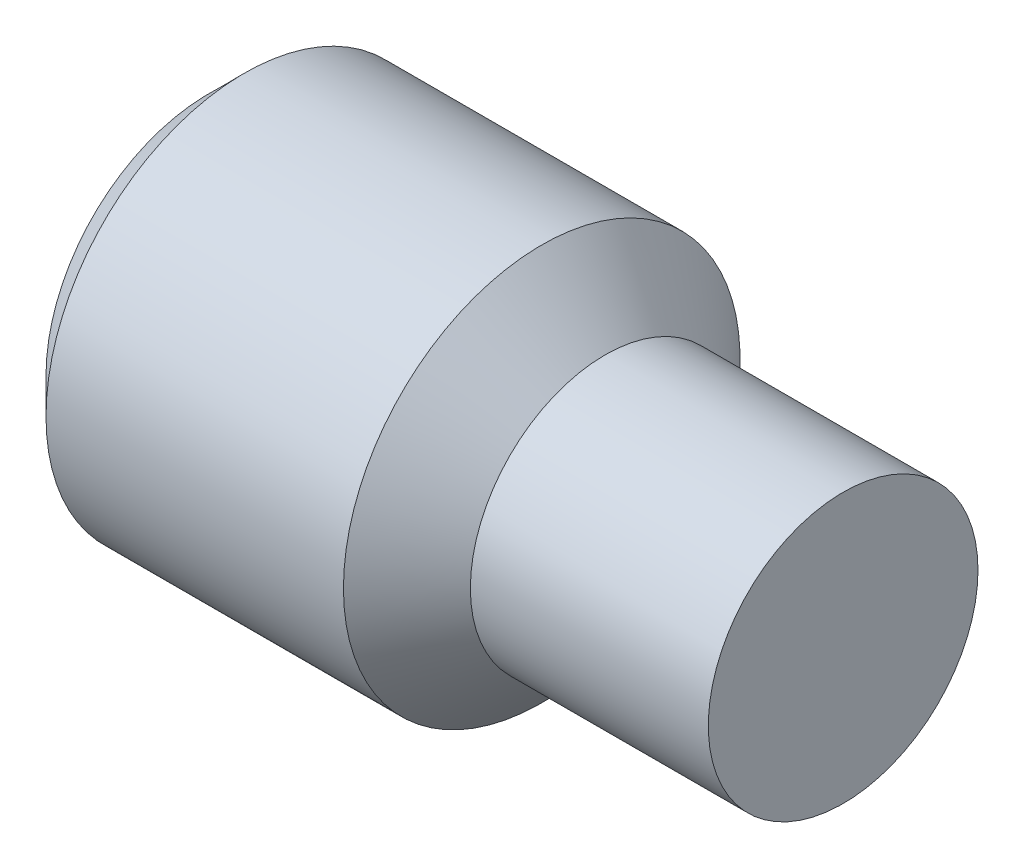
ISO-10303-21;
HEADER;
FILE_DESCRIPTION(('STEP AP214'),'2;1');
FILE_NAME('part.step','',(''),(''),'','','');
FILE_SCHEMA(('AUTOMOTIVE_DESIGN { 1 0 10303 214 1 1 1 1 }'));
ENDSEC;
DATA;
#1=APPLICATION_CONTEXT('core data for automotive mechanical design processes');
#2=APPLICATION_PROTOCOL_DEFINITION('international standard','automotive_design',2000,#1);
#3=PRODUCT_CONTEXT('',#1,'mechanical');
#4=PRODUCT('Part','Part','',(#3));
#5=PRODUCT_RELATED_PRODUCT_CATEGORY('part','',(#4));
#6=PRODUCT_DEFINITION_FORMATION('','',#4);
#7=PRODUCT_DEFINITION_CONTEXT('part definition',#1,'design');
#8=PRODUCT_DEFINITION('design','',#6,#7);
#9=PRODUCT_DEFINITION_SHAPE('','',#8);
#10=(LENGTH_UNIT() NAMED_UNIT(*) SI_UNIT(.MILLI.,.METRE.));
#11=(NAMED_UNIT(*) PLANE_ANGLE_UNIT() SI_UNIT($,.RADIAN.));
#12=(NAMED_UNIT(*) SI_UNIT($,.STERADIAN.) SOLID_ANGLE_UNIT());
#13=UNCERTAINTY_MEASURE_WITH_UNIT(LENGTH_MEASURE(1.E-05),#10,'distance_accuracy_value','');
#14=(GEOMETRIC_REPRESENTATION_CONTEXT(3) GLOBAL_UNCERTAINTY_ASSIGNED_CONTEXT((#13)) GLOBAL_UNIT_ASSIGNED_CONTEXT((#10,
#11,#12)) REPRESENTATION_CONTEXT('',''));
#15=CARTESIAN_POINT('',(0.,0.,0.));
#16=DIRECTION('',(0.,0.,1.));
#17=DIRECTION('',(1.,0.,0.));
#18=AXIS2_PLACEMENT_3D('',#15,#16,#17);
#19=CARTESIAN_POINT('',(16.,0.,0.));
#20=DIRECTION('',(-1.,0.,0.));
#21=DIRECTION('',(0.,0.,1.));
#22=AXIS2_PLACEMENT_3D('',#19,#20,#21);
#23=CYLINDRICAL_SURFACE('',#22,5.);
#24=CARTESIAN_POINT('',(8.40000000000002,0.,0.));
#25=DIRECTION('',(-1.,0.,0.));
#26=DIRECTION('',(0.,0.,1.));
#27=AXIS2_PLACEMENT_3D('',#24,#25,#26);
#28=CIRCLE('',#27,5.);
#29=CARTESIAN_POINT('',(8.40000000000002,0.,5.));
#30=VERTEX_POINT('',#29);
#31=EDGE_CURVE('E142',#30,#30,#28,.T.);
#32=ORIENTED_EDGE('',*,*,#31,.T.);
#33=EDGE_LOOP('',(#32));
#34=FACE_BOUND('',#33,.T.);
#35=CARTESIAN_POINT('',(0.89999999999999,0.,0.));
#36=DIRECTION('',(-1.,0.,0.));
#37=DIRECTION('',(0.,0.,1.));
#38=AXIS2_PLACEMENT_3D('',#35,#36,#37);
#39=CIRCLE('',#38,5.);
#40=CARTESIAN_POINT('',(0.89999999999999,0.,5.));
#41=VERTEX_POINT('',#40);
#42=EDGE_CURVE('E153',#41,#41,#39,.T.);
#43=ORIENTED_EDGE('',*,*,#42,.F.);
#44=EDGE_LOOP('',(#43));
#45=FACE_BOUND('',#44,.T.);
#46=ADVANCED_FACE('F29',(#34,#45),#23,.T.);
#47=CARTESIAN_POINT('',(10.,0.,0.));
#48=DIRECTION('',(-1.,0.,0.));
#49=DIRECTION('',(0.,0.,1.));
#50=AXIS2_PLACEMENT_3D('',#47,#48,#49);
#51=CONICAL_SURFACE('',#50,3.4,0.785398163397454);
#52=ORIENTED_EDGE('',*,*,#31,.F.);
#53=EDGE_LOOP('',(#52));
#54=FACE_BOUND('',#53,.T.);
#55=CARTESIAN_POINT('',(10.,0.,0.));
#56=DIRECTION('',(-1.,0.,0.));
#57=DIRECTION('',(0.,0.,1.));
#58=AXIS2_PLACEMENT_3D('',#55,#56,#57);
#59=CIRCLE('',#58,3.4);
#60=CARTESIAN_POINT('',(10.,0.,3.4));
#61=VERTEX_POINT('',#60);
#62=EDGE_CURVE('E147',#61,#61,#59,.T.);
#63=ORIENTED_EDGE('',*,*,#62,.T.);
#64=EDGE_LOOP('',(#63));
#65=FACE_BOUND('',#64,.T.);
#66=ADVANCED_FACE('F161',(#54,#65),#51,.T.);
#67=CARTESIAN_POINT('',(16.,0.,0.));
#68=DIRECTION('',(1.,0.,0.));
#69=DIRECTION('',(0.,0.,-1.));
#70=AXIS2_PLACEMENT_3D('',#67,#68,#69);
#71=PLANE('',#70);
#72=CARTESIAN_POINT('',(16.,0.,0.));
#73=DIRECTION('',(1.,0.,0.));
#74=DIRECTION('',(0.,0.,-1.));
#75=AXIS2_PLACEMENT_3D('',#72,#73,#74);
#76=CIRCLE('',#75,3.4);
#77=CARTESIAN_POINT('',(16.,0.,-3.4));
#78=VERTEX_POINT('',#77);
#79=EDGE_CURVE('E140',#78,#78,#76,.T.);
#80=ORIENTED_EDGE('',*,*,#79,.T.);
#81=EDGE_LOOP('',(#80));
#82=FACE_BOUND('',#81,.T.);
#83=ADVANCED_FACE('F167',(#82),#71,.T.);
#84=CARTESIAN_POINT('',(10.,0.,0.));
#85=DIRECTION('',(1.,0.,0.));
#86=DIRECTION('',(0.,0.,-1.));
#87=AXIS2_PLACEMENT_3D('',#84,#85,#86);
#88=CYLINDRICAL_SURFACE('',#87,3.4);
#89=ORIENTED_EDGE('',*,*,#62,.F.);
#90=EDGE_LOOP('',(#89));
#91=FACE_BOUND('',#90,.T.);
#92=ORIENTED_EDGE('',*,*,#79,.F.);
#93=EDGE_LOOP('',(#92));
#94=FACE_BOUND('',#93,.T.);
#95=ADVANCED_FACE('F174',(#91,#94),#88,.T.);
#96=CARTESIAN_POINT('',(0.,0.,0.));
#97=DIRECTION('',(1.,0.,0.));
#98=DIRECTION('',(0.,0.,-1.));
#99=AXIS2_PLACEMENT_3D('',#96,#97,#98);
#100=CONICAL_SURFACE('',#99,4.1,0.785398163397454);
#101=ORIENTED_EDGE('',*,*,#42,.T.);
#102=EDGE_LOOP('',(#101));
#103=FACE_BOUND('',#102,.T.);
#104=CARTESIAN_POINT('',(0.,0.,0.));
#105=DIRECTION('',(-1.,0.,0.));
#106=DIRECTION('',(0.,0.,1.));
#107=AXIS2_PLACEMENT_3D('',#104,#105,#106);
#108=CIRCLE('',#107,4.1);
#109=CARTESIAN_POINT('',(0.,0.,4.1));
#110=VERTEX_POINT('',#109);
#111=EDGE_CURVE('E150',#110,#110,#108,.T.);
#112=ORIENTED_EDGE('',*,*,#111,.F.);
#113=EDGE_LOOP('',(#112));
#114=FACE_BOUND('',#113,.T.);
#115=ADVANCED_FACE('F157',(#103,#114),#100,.T.);
#116=CARTESIAN_POINT('',(6.,-11.1414213562373,0.));
#117=DIRECTION('',(-1.,0.,0.));
#118=DIRECTION('',(0.,0.,1.));
#119=AXIS2_PLACEMENT_3D('',#116,#117,#118);
#120=PLANE('',#119);
#121=DIRECTION('',(0.,-0.499999999999998,0.86602540378444));
#122=VECTOR('',#121,1.);
#123=CARTESIAN_POINT('',(6.,-4.95041884852041,3.57437696438398));
#124=LINE('',#123,#122);
#125=CARTESIAN_POINT('',(6.,-1.44337567297408,-2.5));
#126=VERTEX_POINT('',#125);
#127=CARTESIAN_POINT('',(6.,-2.88675134594813,0.));
#128=VERTEX_POINT('',#127);
#129=EDGE_CURVE('E113',#126,#128,#124,.T.);
#130=ORIENTED_EDGE('',*,*,#129,.T.);
#131=DIRECTION('',(0.,0.499999999999998,0.86602540378444));
#132=VECTOR('',#131,1.);
#133=CARTESIAN_POINT('',(6.,-4.95041884852041,-3.57437696438398));
#134=LINE('',#133,#132);
#135=CARTESIAN_POINT('',(6.,-1.44337567297408,2.5));
#136=VERTEX_POINT('',#135);
#137=EDGE_CURVE('E116',#128,#136,#134,.T.);
#138=ORIENTED_EDGE('',*,*,#137,.T.);
#139=DIRECTION('',(0.,1.,0.));
#140=VECTOR('',#139,1.);
#141=CARTESIAN_POINT('',(6.,-11.1414213562373,2.5));
#142=LINE('',#141,#140);
#143=CARTESIAN_POINT('',(6.,1.44337567297408,2.5));
#144=VERTEX_POINT('',#143);
#145=EDGE_CURVE('E89',#136,#144,#142,.T.);
#146=ORIENTED_EDGE('',*,*,#145,.T.);
#147=DIRECTION('',(0.,0.499999999999998,-0.86602540378444));
#148=VECTOR('',#147,1.);
#149=CARTESIAN_POINT('',(6.,-0.620291829598198,6.07437696438398));
#150=LINE('',#149,#148);
#151=CARTESIAN_POINT('',(6.,2.88675134594814,0.));
#152=VERTEX_POINT('',#151);
#153=EDGE_CURVE('E119',#144,#152,#150,.T.);
#154=ORIENTED_EDGE('',*,*,#153,.T.);
#155=DIRECTION('',(0.,-0.499999999999998,-0.86602540378444));
#156=VECTOR('',#155,1.);
#157=CARTESIAN_POINT('',(6.,-0.620291829598187,-6.07437696438397));
#158=LINE('',#157,#156);
#159=CARTESIAN_POINT('',(6.,1.44337567297408,-2.5));
#160=VERTEX_POINT('',#159);
#161=EDGE_CURVE('E122',#152,#160,#158,.T.);
#162=ORIENTED_EDGE('',*,*,#161,.T.);
#163=DIRECTION('',(0.,-1.,0.));
#164=VECTOR('',#163,1.);
#165=CARTESIAN_POINT('',(6.,-11.1414213562373,-2.5));
#166=LINE('',#165,#164);
#167=EDGE_CURVE('E125',#160,#126,#166,.T.);
#168=ORIENTED_EDGE('',*,*,#167,.T.);
#169=EDGE_LOOP('',(#130,#138,#146,#154,#162,#168));
#170=FACE_BOUND('',#169,.T.);
#171=ADVANCED_FACE('F136',(#170),#120,.T.);
#172=CARTESIAN_POINT('',(6.,-11.1414213562373,2.5));
#173=DIRECTION('',(0.,0.,1.));
#174=DIRECTION('',(1.,0.,0.));
#175=AXIS2_PLACEMENT_3D('',#172,#173,#174);
#176=PLANE('',#175);
#177=DIRECTION('',(0.,1.,0.));
#178=VECTOR('',#177,1.);
#179=CARTESIAN_POINT('',(0.,-11.1414213562373,2.5));
#180=LINE('',#179,#178);
#181=CARTESIAN_POINT('',(0.,-1.44337567297408,2.5));
#182=VERTEX_POINT('',#181);
#183=CARTESIAN_POINT('',(0.,1.44337567297408,2.5));
#184=VERTEX_POINT('',#183);
#185=EDGE_CURVE('E86',#182,#184,#180,.T.);
#186=ORIENTED_EDGE('',*,*,#185,.T.);
#187=DIRECTION('',(-1.,0.,0.));
#188=VECTOR('',#187,1.);
#189=CARTESIAN_POINT('',(6.,1.44337567297408,2.5));
#190=LINE('',#189,#188);
#191=EDGE_CURVE('E93',#144,#184,#190,.T.);
#192=ORIENTED_EDGE('',*,*,#191,.F.);
#193=ORIENTED_EDGE('',*,*,#145,.F.);
#194=DIRECTION('',(-1.,0.,0.));
#195=VECTOR('',#194,1.);
#196=CARTESIAN_POINT('',(6.,-1.44337567297408,2.5));
#197=LINE('',#196,#195);
#198=EDGE_CURVE('E82',#136,#182,#197,.T.);
#199=ORIENTED_EDGE('',*,*,#198,.T.);
#200=EDGE_LOOP('',(#186,#192,#193,#199));
#201=FACE_BOUND('',#200,.T.);
#202=ADVANCED_FACE('F84',(#201),#176,.F.);
#203=CARTESIAN_POINT('',(6.,-0.620291829598198,6.07437696438398));
#204=DIRECTION('',(0.,0.86602540378444,0.499999999999998));
#205=DIRECTION('',(0.,-0.499999999999998,0.86602540378444));
#206=AXIS2_PLACEMENT_3D('',#203,#204,#205);
#207=PLANE('',#206);
#208=DIRECTION('',(0.,0.499999999999998,-0.86602540378444));
#209=VECTOR('',#208,1.);
#210=CARTESIAN_POINT('',(0.,-0.620291829598198,6.07437696438398));
#211=LINE('',#210,#209);
#212=CARTESIAN_POINT('',(0.,2.88675134594814,0.));
#213=VERTEX_POINT('',#212);
#214=EDGE_CURVE('E103',#184,#213,#211,.T.);
#215=ORIENTED_EDGE('',*,*,#214,.T.);
#216=DIRECTION('',(-1.,0.,0.));
#217=VECTOR('',#216,1.);
#218=CARTESIAN_POINT('',(6.,2.88675134594814,0.));
#219=LINE('',#218,#217);
#220=EDGE_CURVE('E129',#152,#213,#219,.T.);
#221=ORIENTED_EDGE('',*,*,#220,.F.);
#222=ORIENTED_EDGE('',*,*,#153,.F.);
#223=ORIENTED_EDGE('',*,*,#191,.T.);
#224=EDGE_LOOP('',(#215,#221,#222,#223));
#225=FACE_BOUND('',#224,.T.);
#226=ADVANCED_FACE('F133',(#225),#207,.F.);
#227=CARTESIAN_POINT('',(6.,-0.620291829598187,-6.07437696438397));
#228=DIRECTION('',(0.,0.86602540378444,-0.499999999999997));
#229=DIRECTION('',(0.,0.499999999999998,0.86602540378444));
#230=AXIS2_PLACEMENT_3D('',#227,#228,#229);
#231=PLANE('',#230);
#232=DIRECTION('',(0.,-0.499999999999998,-0.86602540378444));
#233=VECTOR('',#232,1.);
#234=CARTESIAN_POINT('',(0.,-0.620291829598187,-6.07437696438397));
#235=LINE('',#234,#233);
#236=CARTESIAN_POINT('',(0.,1.44337567297408,-2.5));
#237=VERTEX_POINT('',#236);
#238=EDGE_CURVE('E105',#213,#237,#235,.T.);
#239=ORIENTED_EDGE('',*,*,#238,.T.);
#240=DIRECTION('',(-1.,0.,0.));
#241=VECTOR('',#240,1.);
#242=CARTESIAN_POINT('',(6.,1.44337567297408,-2.5));
#243=LINE('',#242,#241);
#244=EDGE_CURVE('E37',#160,#237,#243,.T.);
#245=ORIENTED_EDGE('',*,*,#244,.F.);
#246=ORIENTED_EDGE('',*,*,#161,.F.);
#247=ORIENTED_EDGE('',*,*,#220,.T.);
#248=EDGE_LOOP('',(#239,#245,#246,#247));
#249=FACE_BOUND('',#248,.T.);
#250=ADVANCED_FACE('F194',(#249),#231,.F.);
#251=CARTESIAN_POINT('',(6.,-11.1414213562373,-2.5));
#252=DIRECTION('',(0.,0.,-1.));
#253=DIRECTION('',(-1.,0.,0.));
#254=AXIS2_PLACEMENT_3D('',#251,#252,#253);
#255=PLANE('',#254);
#256=DIRECTION('',(0.,-1.,0.));
#257=VECTOR('',#256,1.);
#258=CARTESIAN_POINT('',(0.,-11.1414213562373,-2.5));
#259=LINE('',#258,#257);
#260=CARTESIAN_POINT('',(0.,-1.44337567297408,-2.5));
#261=VERTEX_POINT('',#260);
#262=EDGE_CURVE('E111',#237,#261,#259,.T.);
#263=ORIENTED_EDGE('',*,*,#262,.T.);
#264=DIRECTION('',(-1.,0.,0.));
#265=VECTOR('',#264,1.);
#266=CARTESIAN_POINT('',(6.,-1.44337567297408,-2.5));
#267=LINE('',#266,#265);
#268=EDGE_CURVE('E11',#126,#261,#267,.T.);
#269=ORIENTED_EDGE('',*,*,#268,.F.);
#270=ORIENTED_EDGE('',*,*,#167,.F.);
#271=ORIENTED_EDGE('',*,*,#244,.T.);
#272=EDGE_LOOP('',(#263,#269,#270,#271));
#273=FACE_BOUND('',#272,.T.);
#274=ADVANCED_FACE('F139',(#273),#255,.F.);
#275=CARTESIAN_POINT('',(6.,-4.95041884852041,3.57437696438398));
#276=DIRECTION('',(0.,-0.86602540378444,-0.499999999999997));
#277=DIRECTION('',(0.,0.499999999999998,-0.86602540378444));
#278=AXIS2_PLACEMENT_3D('',#275,#276,#277);
#279=PLANE('',#278);
#280=DIRECTION('',(0.,-0.499999999999998,0.86602540378444));
#281=VECTOR('',#280,1.);
#282=CARTESIAN_POINT('',(0.,-4.95041884852041,3.57437696438398));
#283=LINE('',#282,#281);
#284=CARTESIAN_POINT('',(0.,-2.88675134594814,0.));
#285=VERTEX_POINT('',#284);
#286=EDGE_CURVE('E44',#261,#285,#283,.T.);
#287=ORIENTED_EDGE('',*,*,#286,.T.);
#288=DIRECTION('',(-1.,0.,0.));
#289=VECTOR('',#288,1.);
#290=CARTESIAN_POINT('',(6.,-2.88675134594813,0.));
#291=LINE('',#290,#289);
#292=EDGE_CURVE('E32',#128,#285,#291,.T.);
#293=ORIENTED_EDGE('',*,*,#292,.F.);
#294=ORIENTED_EDGE('',*,*,#129,.F.);
#295=ORIENTED_EDGE('',*,*,#268,.T.);
#296=EDGE_LOOP('',(#287,#293,#294,#295));
#297=FACE_BOUND('',#296,.T.);
#298=ADVANCED_FACE('F137',(#297),#279,.F.);
#299=CARTESIAN_POINT('',(6.,-4.95041884852041,-3.57437696438398));
#300=DIRECTION('',(0.,-0.86602540378444,0.499999999999998));
#301=DIRECTION('',(0.,-0.499999999999998,-0.86602540378444));
#302=AXIS2_PLACEMENT_3D('',#299,#300,#301);
#303=PLANE('',#302);
#304=DIRECTION('',(0.,0.499999999999998,0.86602540378444));
#305=VECTOR('',#304,1.);
#306=CARTESIAN_POINT('',(0.,-4.95041884852041,-3.57437696438398));
#307=LINE('',#306,#305);
#308=EDGE_CURVE('E95',#285,#182,#307,.T.);
#309=ORIENTED_EDGE('',*,*,#308,.T.);
#310=ORIENTED_EDGE('',*,*,#198,.F.);
#311=ORIENTED_EDGE('',*,*,#137,.F.);
#312=ORIENTED_EDGE('',*,*,#292,.T.);
#313=EDGE_LOOP('',(#309,#310,#311,#312));
#314=FACE_BOUND('',#313,.T.);
#315=ADVANCED_FACE('F96',(#314),#303,.F.);
#316=CARTESIAN_POINT('',(0.,0.,0.));
#317=DIRECTION('',(1.,0.,0.));
#318=DIRECTION('',(0.,0.,-1.));
#319=AXIS2_PLACEMENT_3D('',#316,#317,#318);
#320=PLANE('',#319);
#321=ORIENTED_EDGE('',*,*,#308,.F.);
#322=ORIENTED_EDGE('',*,*,#286,.F.);
#323=ORIENTED_EDGE('',*,*,#262,.F.);
#324=ORIENTED_EDGE('',*,*,#238,.F.);
#325=ORIENTED_EDGE('',*,*,#214,.F.);
#326=ORIENTED_EDGE('',*,*,#185,.F.);
#327=EDGE_LOOP('',(#321,#322,#323,#324,#325,#326));
#328=FACE_BOUND('',#327,.T.);
#329=ORIENTED_EDGE('',*,*,#111,.T.);
#330=EDGE_LOOP('',(#329));
#331=FACE_BOUND('',#330,.T.);
#332=ADVANCED_FACE('F99',(#328,#331),#320,.F.);
#333=CLOSED_SHELL('',(#46,#66,#83,#95,#115,#171,#202,#226,#250,#274,#298,#315,#332));
#334=MANIFOLD_SOLID_BREP('B2',#333);
#335=ADVANCED_BREP_SHAPE_REPRESENTATION('',(#18,#334),#14);
#336=SHAPE_DEFINITION_REPRESENTATION(#9,#335);
ENDSEC;
END-ISO-10303-21;
